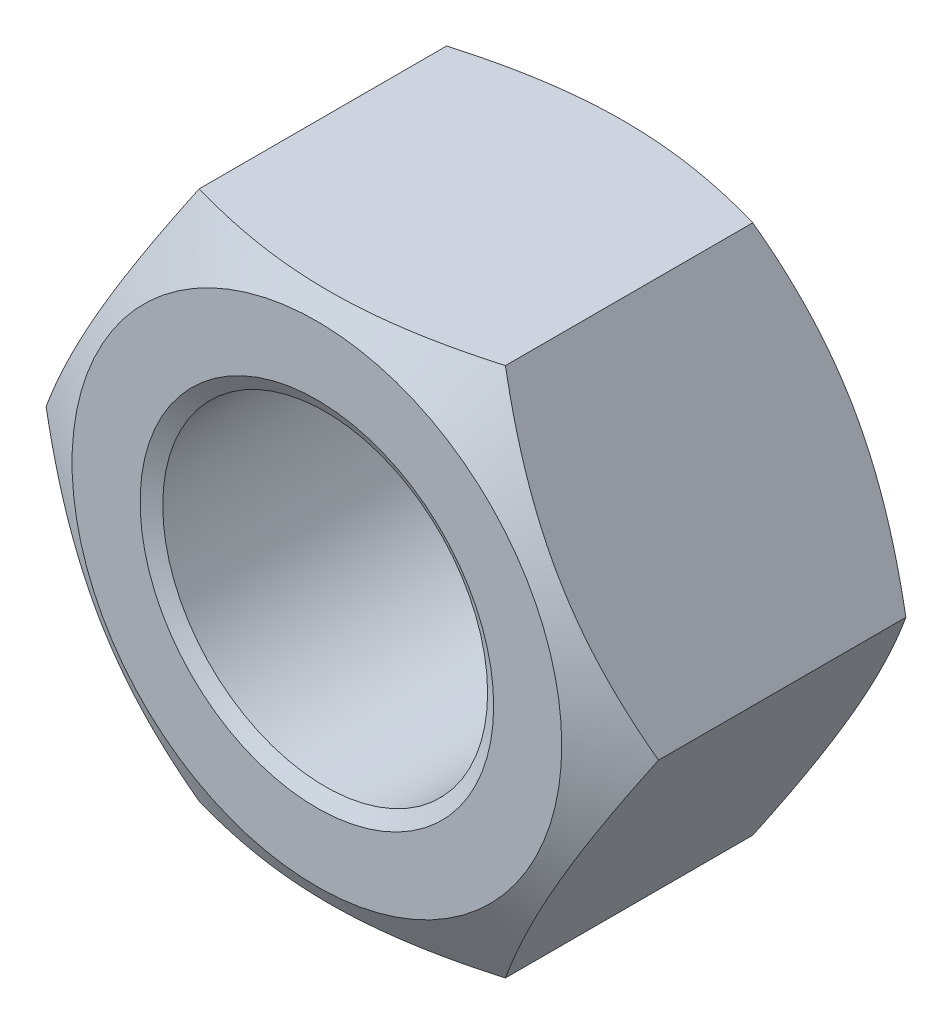
ISO-10303-21;
HEADER;
FILE_DESCRIPTION(('STEP AP214'),'2;1');
FILE_NAME('part.step','',(''),(''),'','','');
FILE_SCHEMA(('AUTOMOTIVE_DESIGN { 1 0 10303 214 1 1 1 1 }'));
ENDSEC;
DATA;
#1=APPLICATION_CONTEXT('core data for automotive mechanical design processes');
#2=APPLICATION_PROTOCOL_DEFINITION('international standard','automotive_design',2000,#1);
#3=PRODUCT_CONTEXT('',#1,'mechanical');
#4=PRODUCT('Part','Part','',(#3));
#5=PRODUCT_RELATED_PRODUCT_CATEGORY('part','',(#4));
#6=PRODUCT_DEFINITION_FORMATION('','',#4);
#7=PRODUCT_DEFINITION_CONTEXT('part definition',#1,'design');
#8=PRODUCT_DEFINITION('design','',#6,#7);
#9=PRODUCT_DEFINITION_SHAPE('','',#8);
#10=(LENGTH_UNIT() NAMED_UNIT(*) SI_UNIT(.MILLI.,.METRE.));
#11=(NAMED_UNIT(*) PLANE_ANGLE_UNIT() SI_UNIT($,.RADIAN.));
#12=(NAMED_UNIT(*) SI_UNIT($,.STERADIAN.) SOLID_ANGLE_UNIT());
#13=UNCERTAINTY_MEASURE_WITH_UNIT(LENGTH_MEASURE(1.E-05),#10,'distance_accuracy_value','');
#14=(GEOMETRIC_REPRESENTATION_CONTEXT(3) GLOBAL_UNCERTAINTY_ASSIGNED_CONTEXT((#13)) GLOBAL_UNIT_ASSIGNED_CONTEXT((#10,
#11,#12)) REPRESENTATION_CONTEXT('',''));
#15=CARTESIAN_POINT('',(0.,0.,0.));
#16=DIRECTION('',(0.,0.,1.));
#17=DIRECTION('',(1.,0.,0.));
#18=AXIS2_PLACEMENT_3D('',#15,#16,#17);
#19=CARTESIAN_POINT('',(0.,0.,0.234368124899163));
#20=DIRECTION('',(0.,0.,-1.));
#21=DIRECTION('',(1.,0.,0.));
#22=AXIS2_PLACEMENT_3D('',#19,#20,#21);
#23=CONICAL_SURFACE('',#22,9.5940625,1.0471975511966);
#24=CARTESIAN_POINT('',(0.,0.,0.468736249798329));
#25=DIRECTION('',(0.,0.,1.));
#26=DIRECTION('',(1.,0.,0.));
#27=AXIS2_PLACEMENT_3D('',#24,#25,#26);
#28=CIRCLE('',#27,9.188125);
#29=CARTESIAN_POINT('',(9.188125,0.,0.468736249798325));
#30=VERTEX_POINT('',#29);
#31=EDGE_CURVE('E13',#30,#30,#28,.T.);
#32=ORIENTED_EDGE('',*,*,#31,.T.);
#33=EDGE_LOOP('',(#32));
#34=FACE_BOUND('',#33,.T.);
#35=CARTESIAN_POINT('',(0.,0.,0.));
#36=DIRECTION('',(0.,0.,1.));
#37=DIRECTION('',(1.,0.,0.));
#38=AXIS2_PLACEMENT_3D('',#35,#36,#37);
#39=CIRCLE('',#38,10.);
#40=CARTESIAN_POINT('',(10.,0.,0.));
#41=VERTEX_POINT('',#40);
#42=EDGE_CURVE('E45',#41,#41,#39,.T.);
#43=ORIENTED_EDGE('',*,*,#42,.F.);
#44=EDGE_LOOP('',(#43));
#45=FACE_BOUND('',#44,.T.);
#46=ADVANCED_FACE('F24',(#34,#45),#23,.F.);
#47=CARTESIAN_POINT('',(0.,0.,9.));
#48=DIRECTION('',(0.,0.,-1.));
#49=DIRECTION('',(1.,0.,0.));
#50=AXIS2_PLACEMENT_3D('',#47,#48,#49);
#51=CYLINDRICAL_SURFACE('',#50,9.188125);
#52=CARTESIAN_POINT('',(0.,0.,17.5312637502017));
#53=DIRECTION('',(0.,0.,1.));
#54=DIRECTION('',(1.,0.,0.));
#55=AXIS2_PLACEMENT_3D('',#52,#53,#54);
#56=CIRCLE('',#55,9.188125);
#57=CARTESIAN_POINT('',(9.188125,0.,17.5312637502017));
#58=VERTEX_POINT('',#57);
#59=EDGE_CURVE('E35',#58,#58,#56,.T.);
#60=ORIENTED_EDGE('',*,*,#59,.T.);
#61=EDGE_LOOP('',(#60));
#62=FACE_BOUND('',#61,.T.);
#63=ORIENTED_EDGE('',*,*,#31,.F.);
#64=EDGE_LOOP('',(#63));
#65=FACE_BOUND('',#64,.T.);
#66=ADVANCED_FACE('F241',(#62,#65),#51,.F.);
#67=CARTESIAN_POINT('',(0.,0.,17.7656318751009));
#68=DIRECTION('',(0.,0.,1.));
#69=DIRECTION('',(1.,0.,0.));
#70=AXIS2_PLACEMENT_3D('',#67,#68,#69);
#71=CONICAL_SURFACE('',#70,9.5940625,1.0471975511966);
#72=CARTESIAN_POINT('',(0.,0.,18.));
#73=DIRECTION('',(0.,0.,-1.));
#74=DIRECTION('',(1.,0.,0.));
#75=AXIS2_PLACEMENT_3D('',#72,#73,#74);
#76=CIRCLE('',#75,10.);
#77=CARTESIAN_POINT('',(10.,0.,18.));
#78=VERTEX_POINT('',#77);
#79=EDGE_CURVE('E162',#78,#78,#76,.T.);
#80=ORIENTED_EDGE('',*,*,#79,.F.);
#81=EDGE_LOOP('',(#80));
#82=FACE_BOUND('',#81,.T.);
#83=ORIENTED_EDGE('',*,*,#59,.F.);
#84=EDGE_LOOP('',(#83));
#85=FACE_BOUND('',#84,.T.);
#86=ADVANCED_FACE('F247',(#82,#85),#71,.F.);
#87=CARTESIAN_POINT('',(0.,0.,1.00184938586184));
#88=DIRECTION('',(0.,0.,1.));
#89=DIRECTION('',(1.,0.,0.));
#90=AXIS2_PLACEMENT_3D('',#87,#88,#89);
#91=CONICAL_SURFACE('',#90,15.5852540378444,1.0471975511966);
#92=CARTESIAN_POINT('',(17.3205080756888,0.,2.00369877172368));
#93=CARTESIAN_POINT('',(12.9903810567665,-7.5,-0.496301228276316));
#94=CARTESIAN_POINT('',(8.66025403784438,-15.,2.00369877172368));
#95=(BOUNDED_CURVE() B_SPLINE_CURVE(2,(#92,#93,#94),.UNSPECIFIED.,.F.,
.F.) B_SPLINE_CURVE_WITH_KNOTS((3,3),(0.,17.5265420711688),
.UNSPECIFIED.) CURVE() GEOMETRIC_REPRESENTATION_ITEM() RATIONAL_B_SPLINE_CURVE((1.,
1.15470053837925,1.)) REPRESENTATION_ITEM(''));
#96=CARTESIAN_POINT('',(17.3205080756888,0.,2.00369877172368));
#97=VERTEX_POINT('',#96);
#98=CARTESIAN_POINT('',(8.66025403784438,-15.,2.00369877172369));
#99=VERTEX_POINT('',#98);
#100=EDGE_CURVE('E133',#97,#99,#95,.T.);
#101=ORIENTED_EDGE('',*,*,#100,.T.);
#102=CARTESIAN_POINT('',(8.66025403784439,-15.,2.00369877172369));
#103=CARTESIAN_POINT('',(0.,-14.9999999999999,-0.496301228276319));
#104=CARTESIAN_POINT('',(-8.66025403784439,-15.,2.00369877172368));
#105=(BOUNDED_CURVE() B_SPLINE_CURVE(2,(#102,#103,#104),.UNSPECIFIED.,.F.,
.F.) B_SPLINE_CURVE_WITH_KNOTS((3,3),(0.,17.5265420711688),
.UNSPECIFIED.) CURVE() GEOMETRIC_REPRESENTATION_ITEM() RATIONAL_B_SPLINE_CURVE((1.,
1.15470053837925,1.)) REPRESENTATION_ITEM(''));
#106=CARTESIAN_POINT('',(-8.66025403784439,-15.,2.00369877172368));
#107=VERTEX_POINT('',#106);
#108=EDGE_CURVE('E125',#99,#107,#105,.T.);
#109=ORIENTED_EDGE('',*,*,#108,.T.);
#110=CARTESIAN_POINT('',(-8.66025403784439,-15.,2.00369877172368));
#111=CARTESIAN_POINT('',(-12.9903810567666,-7.5,-0.496301228276313));
#112=CARTESIAN_POINT('',(-17.3205080756886,0.,2.00369877172368));
#113=(BOUNDED_CURVE() B_SPLINE_CURVE(2,(#110,#111,#112),.UNSPECIFIED.,.F.,
.F.) B_SPLINE_CURVE_WITH_KNOTS((3,3),(0.,17.5265420711688),
.UNSPECIFIED.) CURVE() GEOMETRIC_REPRESENTATION_ITEM() RATIONAL_B_SPLINE_CURVE((1.,
1.15470053837925,1.)) REPRESENTATION_ITEM(''));
#114=CARTESIAN_POINT('',(-17.3205080756887,0.,2.00369877172368));
#115=VERTEX_POINT('',#114);
#116=EDGE_CURVE('E124',#107,#115,#113,.T.);
#117=ORIENTED_EDGE('',*,*,#116,.T.);
#118=CARTESIAN_POINT('',(-17.3205080756886,0.,2.00369877172368));
#119=CARTESIAN_POINT('',(-12.9903810567666,7.50000000000001,-0.496301228276319));
#120=CARTESIAN_POINT('',(-8.66025403784438,15.,2.00369877172368));
#121=(BOUNDED_CURVE() B_SPLINE_CURVE(2,(#118,#119,#120),.UNSPECIFIED.,.F.,
.F.) B_SPLINE_CURVE_WITH_KNOTS((3,3),(0.,17.5265420711688),
.UNSPECIFIED.) CURVE() GEOMETRIC_REPRESENTATION_ITEM() RATIONAL_B_SPLINE_CURVE((1.,
1.15470053837925,1.)) REPRESENTATION_ITEM(''));
#122=CARTESIAN_POINT('',(-8.66025403784438,15.,2.00369877172368));
#123=VERTEX_POINT('',#122);
#124=EDGE_CURVE('E119',#115,#123,#121,.T.);
#125=ORIENTED_EDGE('',*,*,#124,.T.);
#126=CARTESIAN_POINT('',(-8.66025403784439,15.,2.00369877172368));
#127=CARTESIAN_POINT('',(0.,15.,-0.496301228276319));
#128=CARTESIAN_POINT('',(8.66025403784439,15.,2.00369877172368));
#129=(BOUNDED_CURVE() B_SPLINE_CURVE(2,(#126,#127,#128),.UNSPECIFIED.,.F.,
.F.) B_SPLINE_CURVE_WITH_KNOTS((3,3),(0.,17.5265420711688),
.UNSPECIFIED.) CURVE() GEOMETRIC_REPRESENTATION_ITEM() RATIONAL_B_SPLINE_CURVE((1.,
1.15470053837925,1.)) REPRESENTATION_ITEM(''));
#130=CARTESIAN_POINT('',(8.66025403784439,15.,2.00369877172368));
#131=VERTEX_POINT('',#130);
#132=EDGE_CURVE('E28',#123,#131,#129,.T.);
#133=ORIENTED_EDGE('',*,*,#132,.T.);
#134=CARTESIAN_POINT('',(8.66025403784439,15.,2.00369877172368));
#135=CARTESIAN_POINT('',(12.9903810567665,7.49999999999998,-0.496301228276319));
#136=CARTESIAN_POINT('',(17.3205080756888,0.,2.00369877172368));
#137=(BOUNDED_CURVE() B_SPLINE_CURVE(2,(#134,#135,#136),.UNSPECIFIED.,.F.,
.F.) B_SPLINE_CURVE_WITH_KNOTS((3,3),(0.,17.5265420711688),
.UNSPECIFIED.) CURVE() GEOMETRIC_REPRESENTATION_ITEM() RATIONAL_B_SPLINE_CURVE((1.,
1.15470053837925,1.)) REPRESENTATION_ITEM(''));
#138=EDGE_CURVE('E181',#131,#97,#137,.T.);
#139=ORIENTED_EDGE('',*,*,#138,.T.);
#140=EDGE_LOOP('',(#101,#109,#117,#125,#133,#139));
#141=FACE_BOUND('',#140,.T.);
#142=CARTESIAN_POINT('',(0.,0.,0.));
#143=DIRECTION('',(0.,0.,1.));
#144=DIRECTION('',(1.,0.,0.));
#145=AXIS2_PLACEMENT_3D('',#142,#143,#144);
#146=CIRCLE('',#145,13.85);
#147=CARTESIAN_POINT('',(13.85,0.,0.));
#148=VERTEX_POINT('',#147);
#149=EDGE_CURVE('E199',#148,#148,#146,.T.);
#150=ORIENTED_EDGE('',*,*,#149,.T.);
#151=EDGE_LOOP('',(#150));
#152=FACE_BOUND('',#151,.T.);
#153=ADVANCED_FACE('F176',(#141,#152),#91,.T.);
#154=CARTESIAN_POINT('',(0.,0.,16.9981506141382));
#155=DIRECTION('',(0.,0.,-1.));
#156=DIRECTION('',(1.,0.,0.));
#157=AXIS2_PLACEMENT_3D('',#154,#155,#156);
#158=CONICAL_SURFACE('',#157,15.5852540378444,1.0471975511966);
#159=CARTESIAN_POINT('',(8.66025403784441,-14.9999999999999,15.9963012282763));
#160=CARTESIAN_POINT('',(12.9903810567665,-7.49999999999994,18.4963012282763));
#161=CARTESIAN_POINT('',(17.3205080756888,0.,15.9963012282763));
#162=(BOUNDED_CURVE() B_SPLINE_CURVE(2,(#159,#160,#161),.UNSPECIFIED.,.F.,
.F.) B_SPLINE_CURVE_WITH_KNOTS((3,3),(0.,17.5265420711688),
.UNSPECIFIED.) CURVE() GEOMETRIC_REPRESENTATION_ITEM() RATIONAL_B_SPLINE_CURVE((1.,
1.15470053837925,1.)) REPRESENTATION_ITEM(''));
#163=CARTESIAN_POINT('',(8.66025403784441,-14.9999999999999,15.9963012282763));
#164=VERTEX_POINT('',#163);
#165=CARTESIAN_POINT('',(17.3205080756888,0.,15.9963012282763));
#166=VERTEX_POINT('',#165);
#167=EDGE_CURVE('E153',#164,#166,#162,.T.);
#168=ORIENTED_EDGE('',*,*,#167,.T.);
#169=CARTESIAN_POINT('',(17.3205080756888,0.,15.9963012282763));
#170=CARTESIAN_POINT('',(12.9903810567666,7.49999999999998,18.4963012282763));
#171=CARTESIAN_POINT('',(8.66025403784439,15.,15.9963012282763));
#172=(BOUNDED_CURVE() B_SPLINE_CURVE(2,(#169,#170,#171),.UNSPECIFIED.,.F.,
.F.) B_SPLINE_CURVE_WITH_KNOTS((3,3),(0.,17.5265420711688),
.UNSPECIFIED.) CURVE() GEOMETRIC_REPRESENTATION_ITEM() RATIONAL_B_SPLINE_CURVE((1.,
1.15470053837925,1.)) REPRESENTATION_ITEM(''));
#173=CARTESIAN_POINT('',(8.66025403784439,15.,15.9963012282763));
#174=VERTEX_POINT('',#173);
#175=EDGE_CURVE('E86',#166,#174,#172,.T.);
#176=ORIENTED_EDGE('',*,*,#175,.T.);
#177=CARTESIAN_POINT('',(8.66025403784438,15.,15.9963012282763));
#178=CARTESIAN_POINT('',(0.,15.,18.4963012282763));
#179=CARTESIAN_POINT('',(-8.66025403784432,15.,15.9963012282763));
#180=(BOUNDED_CURVE() B_SPLINE_CURVE(2,(#177,#178,#179),.UNSPECIFIED.,.F.,
.F.) B_SPLINE_CURVE_WITH_KNOTS((3,3),(0.,17.5265420711688),
.UNSPECIFIED.) CURVE() GEOMETRIC_REPRESENTATION_ITEM() RATIONAL_B_SPLINE_CURVE((1.,
1.15470053837925,1.)) REPRESENTATION_ITEM(''));
#181=CARTESIAN_POINT('',(-8.66025403784432,15.,15.9963012282763));
#182=VERTEX_POINT('',#181);
#183=EDGE_CURVE('E94',#174,#182,#180,.T.);
#184=ORIENTED_EDGE('',*,*,#183,.T.);
#185=CARTESIAN_POINT('',(-8.66025403784432,15.,15.9963012282763));
#186=CARTESIAN_POINT('',(-12.9903810567665,7.50000000000001,18.4963012282763));
#187=CARTESIAN_POINT('',(-17.3205080756887,0.,15.9963012282763));
#188=(BOUNDED_CURVE() B_SPLINE_CURVE(2,(#185,#186,#187),.UNSPECIFIED.,.F.,
.F.) B_SPLINE_CURVE_WITH_KNOTS((3,3),(0.,17.5265420711688),
.UNSPECIFIED.) CURVE() GEOMETRIC_REPRESENTATION_ITEM() RATIONAL_B_SPLINE_CURVE((1.,
1.15470053837926,1.)) REPRESENTATION_ITEM(''));
#189=CARTESIAN_POINT('',(-17.3205080756887,0.,15.9963012282763));
#190=VERTEX_POINT('',#189);
#191=EDGE_CURVE('E147',#182,#190,#188,.T.);
#192=ORIENTED_EDGE('',*,*,#191,.T.);
#193=CARTESIAN_POINT('',(-17.3205080756886,0.,15.9963012282763));
#194=CARTESIAN_POINT('',(-12.9903810567666,-7.5,18.4963012282763));
#195=CARTESIAN_POINT('',(-8.66025403784433,-14.9999999999999,15.9963012282763));
#196=(BOUNDED_CURVE() B_SPLINE_CURVE(2,(#193,#194,#195),.UNSPECIFIED.,.F.,
.F.) B_SPLINE_CURVE_WITH_KNOTS((3,3),(0.,17.5265420711688),
.UNSPECIFIED.) CURVE() GEOMETRIC_REPRESENTATION_ITEM() RATIONAL_B_SPLINE_CURVE((1.,
1.15470053837925,1.)) REPRESENTATION_ITEM(''));
#197=CARTESIAN_POINT('',(-8.66025403784433,-14.9999999999999,15.9963012282763));
#198=VERTEX_POINT('',#197);
#199=EDGE_CURVE('E109',#190,#198,#196,.T.);
#200=ORIENTED_EDGE('',*,*,#199,.T.);
#201=CARTESIAN_POINT('',(-8.66025403784433,-14.9999999999999,15.9963012282763));
#202=CARTESIAN_POINT('',(0.,-15.,18.4963012282763));
#203=CARTESIAN_POINT('',(8.6602540378444,-15.,15.9963012282763));
#204=(BOUNDED_CURVE() B_SPLINE_CURVE(2,(#201,#202,#203),.UNSPECIFIED.,.F.,
.F.) B_SPLINE_CURVE_WITH_KNOTS((3,3),(0.,17.5265420711688),
.UNSPECIFIED.) CURVE() GEOMETRIC_REPRESENTATION_ITEM() RATIONAL_B_SPLINE_CURVE((1.,
1.15470053837925,1.)) REPRESENTATION_ITEM(''));
#205=EDGE_CURVE('E106',#198,#164,#204,.T.);
#206=ORIENTED_EDGE('',*,*,#205,.T.);
#207=EDGE_LOOP('',(#168,#176,#184,#192,#200,#206));
#208=FACE_BOUND('',#207,.T.);
#209=CARTESIAN_POINT('',(0.,0.,18.));
#210=DIRECTION('',(0.,0.,-1.));
#211=DIRECTION('',(1.,0.,0.));
#212=AXIS2_PLACEMENT_3D('',#209,#210,#211);
#213=CIRCLE('',#212,13.85);
#214=CARTESIAN_POINT('',(13.85,0.,18.));
#215=VERTEX_POINT('',#214);
#216=EDGE_CURVE('E103',#215,#215,#213,.T.);
#217=ORIENTED_EDGE('',*,*,#216,.T.);
#218=EDGE_LOOP('',(#217));
#219=FACE_BOUND('',#218,.T.);
#220=ADVANCED_FACE('F26',(#208,#219),#158,.T.);
#221=CARTESIAN_POINT('',(-12.9903810567666,7.5,0.));
#222=DIRECTION('',(-0.866025403784439,0.5,0.));
#223=DIRECTION('',(-0.5,-0.866025403784439,0.));
#224=AXIS2_PLACEMENT_3D('',#221,#222,#223);
#225=PLANE('',#224);
#226=ORIENTED_EDGE('',*,*,#191,.F.);
#227=DIRECTION('',(0.,0.,1.));
#228=VECTOR('',#227,1.);
#229=CARTESIAN_POINT('',(-8.66025403784436,15.,0.));
#230=LINE('',#229,#228);
#231=EDGE_CURVE('E112',#123,#182,#230,.T.);
#232=ORIENTED_EDGE('',*,*,#231,.F.);
#233=ORIENTED_EDGE('',*,*,#124,.F.);
#234=DIRECTION('',(0.,0.,1.));
#235=VECTOR('',#234,1.);
#236=CARTESIAN_POINT('',(-17.3205080756886,0.,0.));
#237=LINE('',#236,#235);
#238=EDGE_CURVE('E107',#115,#190,#237,.T.);
#239=ORIENTED_EDGE('',*,*,#238,.T.);
#240=EDGE_LOOP('',(#226,#232,#233,#239));
#241=FACE_BOUND('',#240,.T.);
#242=ADVANCED_FACE('F252',(#241),#225,.T.);
#243=CARTESIAN_POINT('',(0.,14.9999999999999,0.));
#244=DIRECTION('',(0.,1.,0.));
#245=DIRECTION('',(-1.,0.,0.));
#246=AXIS2_PLACEMENT_3D('',#243,#244,#245);
#247=PLANE('',#246);
#248=ORIENTED_EDGE('',*,*,#183,.F.);
#249=DIRECTION('',(0.,0.,1.));
#250=VECTOR('',#249,1.);
#251=CARTESIAN_POINT('',(8.66025403784437,15.,0.));
#252=LINE('',#251,#250);
#253=EDGE_CURVE('E118',#131,#174,#252,.T.);
#254=ORIENTED_EDGE('',*,*,#253,.F.);
#255=ORIENTED_EDGE('',*,*,#132,.F.);
#256=ORIENTED_EDGE('',*,*,#231,.T.);
#257=EDGE_LOOP('',(#248,#254,#255,#256));
#258=FACE_BOUND('',#257,.T.);
#259=ADVANCED_FACE('F255',(#258),#247,.T.);
#260=CARTESIAN_POINT('',(12.9903810567666,7.5,0.));
#261=DIRECTION('',(0.866025403784438,0.5,0.));
#262=DIRECTION('',(-0.5,0.866025403784438,0.));
#263=AXIS2_PLACEMENT_3D('',#260,#261,#262);
#264=PLANE('',#263);
#265=ORIENTED_EDGE('',*,*,#175,.F.);
#266=DIRECTION('',(0.,0.,1.));
#267=VECTOR('',#266,1.);
#268=CARTESIAN_POINT('',(17.3205080756888,0.,0.));
#269=LINE('',#268,#267);
#270=EDGE_CURVE('E211',#97,#166,#269,.T.);
#271=ORIENTED_EDGE('',*,*,#270,.F.);
#272=ORIENTED_EDGE('',*,*,#138,.F.);
#273=ORIENTED_EDGE('',*,*,#253,.T.);
#274=EDGE_LOOP('',(#265,#271,#272,#273));
#275=FACE_BOUND('',#274,.T.);
#276=ADVANCED_FACE('F236',(#275),#264,.T.);
#277=CARTESIAN_POINT('',(12.9903810567666,-7.49999999999998,0.));
#278=DIRECTION('',(0.866025403784439,-0.5,0.));
#279=DIRECTION('',(0.5,0.866025403784439,0.));
#280=AXIS2_PLACEMENT_3D('',#277,#278,#279);
#281=PLANE('',#280);
#282=ORIENTED_EDGE('',*,*,#167,.F.);
#283=DIRECTION('',(0.,0.,1.));
#284=VECTOR('',#283,1.);
#285=CARTESIAN_POINT('',(8.66025403784439,-15.,0.));
#286=LINE('',#285,#284);
#287=EDGE_CURVE('E186',#99,#164,#286,.T.);
#288=ORIENTED_EDGE('',*,*,#287,.F.);
#289=ORIENTED_EDGE('',*,*,#100,.F.);
#290=ORIENTED_EDGE('',*,*,#270,.T.);
#291=EDGE_LOOP('',(#282,#288,#289,#290));
#292=FACE_BOUND('',#291,.T.);
#293=ADVANCED_FACE('F187',(#292),#281,.T.);
#294=CARTESIAN_POINT('',(0.,0.,0.));
#295=DIRECTION('',(0.,0.,1.));
#296=DIRECTION('',(0.,-1.,0.));
#297=AXIS2_PLACEMENT_3D('',#294,#295,#296);
#298=PLANE('',#297);
#299=ORIENTED_EDGE('',*,*,#42,.T.);
#300=EDGE_LOOP('',(#299));
#301=FACE_BOUND('',#300,.T.);
#302=ORIENTED_EDGE('',*,*,#149,.F.);
#303=EDGE_LOOP('',(#302));
#304=FACE_BOUND('',#303,.T.);
#305=ADVANCED_FACE('F224',(#301,#304),#298,.F.);
#306=CARTESIAN_POINT('',(0.,0.,18.));
#307=DIRECTION('',(0.,0.,1.));
#308=DIRECTION('',(0.,-1.,0.));
#309=AXIS2_PLACEMENT_3D('',#306,#307,#308);
#310=PLANE('',#309);
#311=ORIENTED_EDGE('',*,*,#79,.T.);
#312=EDGE_LOOP('',(#311));
#313=FACE_BOUND('',#312,.T.);
#314=ORIENTED_EDGE('',*,*,#216,.F.);
#315=EDGE_LOOP('',(#314));
#316=FACE_BOUND('',#315,.T.);
#317=ADVANCED_FACE('F104',(#313,#316),#310,.T.);
#318=CARTESIAN_POINT('',(0.,-15.,0.));
#319=DIRECTION('',(0.,-1.,0.));
#320=DIRECTION('',(1.,0.,0.));
#321=AXIS2_PLACEMENT_3D('',#318,#319,#320);
#322=PLANE('',#321);
#323=ORIENTED_EDGE('',*,*,#205,.F.);
#324=DIRECTION('',(0.,0.,1.));
#325=VECTOR('',#324,1.);
#326=CARTESIAN_POINT('',(-8.6602540378444,-15.,0.));
#327=LINE('',#326,#325);
#328=EDGE_CURVE('E116',#107,#198,#327,.T.);
#329=ORIENTED_EDGE('',*,*,#328,.F.);
#330=ORIENTED_EDGE('',*,*,#108,.F.);
#331=ORIENTED_EDGE('',*,*,#287,.T.);
#332=EDGE_LOOP('',(#323,#329,#330,#331));
#333=FACE_BOUND('',#332,.T.);
#334=ADVANCED_FACE('F233',(#333),#322,.T.);
#335=CARTESIAN_POINT('',(-12.9903810567666,-7.5,0.));
#336=DIRECTION('',(-0.866025403784438,-0.5,0.));
#337=DIRECTION('',(0.5,-0.866025403784438,0.));
#338=AXIS2_PLACEMENT_3D('',#335,#336,#337);
#339=PLANE('',#338);
#340=ORIENTED_EDGE('',*,*,#199,.F.);
#341=ORIENTED_EDGE('',*,*,#238,.F.);
#342=ORIENTED_EDGE('',*,*,#116,.F.);
#343=ORIENTED_EDGE('',*,*,#328,.T.);
#344=EDGE_LOOP('',(#340,#341,#342,#343));
#345=FACE_BOUND('',#344,.T.);
#346=ADVANCED_FACE('F257',(#345),#339,.T.);
#347=CLOSED_SHELL('',(#46,#66,#86,#153,#220,#242,#259,#276,#293,#305,#317,#334,#346));
#348=MANIFOLD_SOLID_BREP('B1',#347);
#349=ADVANCED_BREP_SHAPE_REPRESENTATION('',(#18,#348),#14);
#350=SHAPE_DEFINITION_REPRESENTATION(#9,#349);
ENDSEC;
END-ISO-10303-21;
